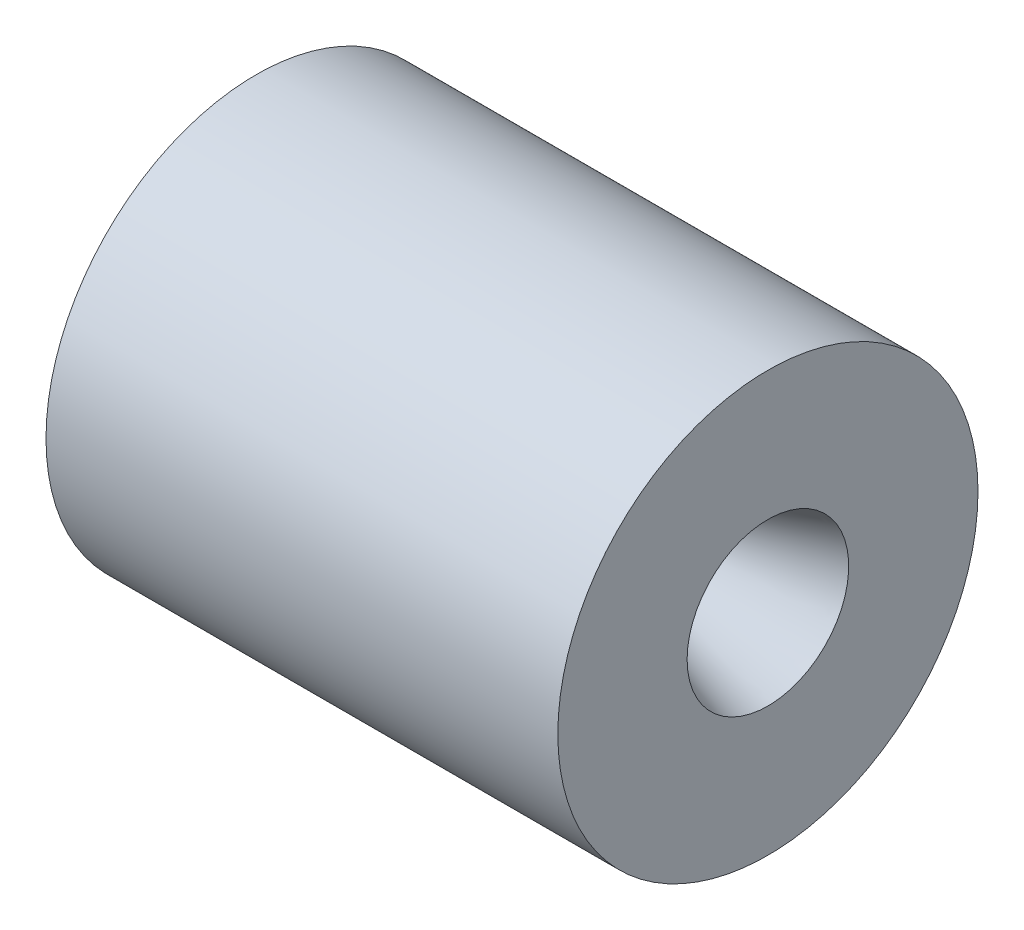
ISO-10303-21;
HEADER;
FILE_DESCRIPTION(('STEP AP214'),'2;1');
FILE_NAME('part.step','',(''),(''),'','','');
FILE_SCHEMA(('AUTOMOTIVE_DESIGN { 1 0 10303 214 1 1 1 1 }'));
ENDSEC;
DATA;
#1=APPLICATION_CONTEXT('core data for automotive mechanical design processes');
#2=APPLICATION_PROTOCOL_DEFINITION('international standard','automotive_design',2000,#1);
#3=PRODUCT_CONTEXT('',#1,'mechanical');
#4=PRODUCT('Part','Part','',(#3));
#5=PRODUCT_RELATED_PRODUCT_CATEGORY('part','',(#4));
#6=PRODUCT_DEFINITION_FORMATION('','',#4);
#7=PRODUCT_DEFINITION_CONTEXT('part definition',#1,'design');
#8=PRODUCT_DEFINITION('design','',#6,#7);
#9=PRODUCT_DEFINITION_SHAPE('','',#8);
#10=(LENGTH_UNIT() NAMED_UNIT(*) SI_UNIT(.MILLI.,.METRE.));
#11=(NAMED_UNIT(*) PLANE_ANGLE_UNIT() SI_UNIT($,.RADIAN.));
#12=(NAMED_UNIT(*) SI_UNIT($,.STERADIAN.) SOLID_ANGLE_UNIT());
#13=UNCERTAINTY_MEASURE_WITH_UNIT(LENGTH_MEASURE(1.E-05),#10,'distance_accuracy_value','');
#14=(GEOMETRIC_REPRESENTATION_CONTEXT(3) GLOBAL_UNCERTAINTY_ASSIGNED_CONTEXT((#13)) GLOBAL_UNIT_ASSIGNED_CONTEXT((#10,
#11,#12)) REPRESENTATION_CONTEXT('',''));
#15=CARTESIAN_POINT('',(0.,0.,0.));
#16=DIRECTION('',(0.,0.,1.));
#17=DIRECTION('',(1.,0.,0.));
#18=AXIS2_PLACEMENT_3D('',#15,#16,#17);
#19=CARTESIAN_POINT('',(0.,55.140272,0.));
#20=DIRECTION('',(1.,0.,0.));
#21=DIRECTION('',(0.,0.,-1.));
#22=AXIS2_PLACEMENT_3D('',#19,#20,#21);
#23=PLANE('',#22);
#24=CARTESIAN_POINT('',(0.,-69.,-2.40912212380176E-13));
#25=DIRECTION('',(-1.,0.,0.));
#26=DIRECTION('',(0.,0.,1.));
#27=AXIS2_PLACEMENT_3D('',#24,#25,#26);
#28=CIRCLE('',#27,2.0193);
#29=CARTESIAN_POINT('',(0.,-69.,2.01929999999976));
#30=VERTEX_POINT('',#29);
#31=EDGE_CURVE('E136',#30,#30,#28,.T.);
#32=ORIENTED_EDGE('',*,*,#31,.F.);
#33=EDGE_LOOP('',(#32));
#34=FACE_BOUND('',#33,.T.);
#35=CARTESIAN_POINT('',(0.,-59.7557528611264,34.4999999999999));
#36=DIRECTION('',(-1.,0.,0.));
#37=DIRECTION('',(0.,0.,1.));
#38=AXIS2_PLACEMENT_3D('',#35,#36,#37);
#39=CIRCLE('',#38,2.01929999999999);
#40=CARTESIAN_POINT('',(0.,-59.7557528611264,36.5192999999999));
#41=VERTEX_POINT('',#40);
#42=EDGE_CURVE('E142',#41,#41,#39,.T.);
#43=ORIENTED_EDGE('',*,*,#42,.F.);
#44=EDGE_LOOP('',(#43));
#45=FACE_BOUND('',#44,.T.);
#46=CARTESIAN_POINT('',(0.,-34.5000000000001,59.7557528611262));
#47=DIRECTION('',(-1.,0.,0.));
#48=DIRECTION('',(0.,0.,1.));
#49=AXIS2_PLACEMENT_3D('',#46,#47,#48);
#50=CIRCLE('',#49,2.0193);
#51=CARTESIAN_POINT('',(0.,-34.5000000000001,61.7750528611262));
#52=VERTEX_POINT('',#51);
#53=EDGE_CURVE('E148',#52,#52,#50,.T.);
#54=ORIENTED_EDGE('',*,*,#53,.F.);
#55=EDGE_LOOP('',(#54));
#56=FACE_BOUND('',#55,.T.);
#57=CARTESIAN_POINT('',(0.,0.,69.));
#58=DIRECTION('',(-1.,0.,0.));
#59=DIRECTION('',(0.,0.,1.));
#60=AXIS2_PLACEMENT_3D('',#57,#58,#59);
#61=CIRCLE('',#60,2.0193);
#62=CARTESIAN_POINT('',(0.,0.,71.0193));
#63=VERTEX_POINT('',#62);
#64=EDGE_CURVE('E154',#63,#63,#61,.T.);
#65=ORIENTED_EDGE('',*,*,#64,.F.);
#66=EDGE_LOOP('',(#65));
#67=FACE_BOUND('',#66,.T.);
#68=CARTESIAN_POINT('',(0.,0.,0.));
#69=DIRECTION('',(-1.,0.,0.));
#70=DIRECTION('',(0.,0.,1.));
#71=AXIS2_PLACEMENT_3D('',#68,#69,#70);
#72=CIRCLE('',#71,55.140272);
#73=CARTESIAN_POINT('',(0.,0.,55.140272));
#74=VERTEX_POINT('',#73);
#75=EDGE_CURVE('E181',#74,#74,#72,.T.);
#76=ORIENTED_EDGE('',*,*,#75,.F.);
#77=EDGE_LOOP('',(#76));
#78=FACE_BOUND('',#77,.T.);
#79=CARTESIAN_POINT('',(0.,0.,0.));
#80=DIRECTION('',(-1.,0.,0.));
#81=DIRECTION('',(0.,0.,1.));
#82=AXIS2_PLACEMENT_3D('',#79,#80,#81);
#83=CIRCLE('',#82,76.200272);
#84=CARTESIAN_POINT('',(0.,0.,76.200272));
#85=VERTEX_POINT('',#84);
#86=EDGE_CURVE('E184',#85,#85,#83,.T.);
#87=ORIENTED_EDGE('',*,*,#86,.T.);
#88=EDGE_LOOP('',(#87));
#89=FACE_BOUND('',#88,.T.);
#90=CARTESIAN_POINT('',(0.,-59.7557528611261,-34.5000000000003));
#91=DIRECTION('',(-1.,0.,0.));
#92=DIRECTION('',(0.,0.,1.));
#93=AXIS2_PLACEMENT_3D('',#90,#91,#92);
#94=CIRCLE('',#93,2.0193);
#95=CARTESIAN_POINT('',(0.,-59.7557528611261,-32.4807000000003));
#96=VERTEX_POINT('',#95);
#97=EDGE_CURVE('E130',#96,#96,#94,.T.);
#98=ORIENTED_EDGE('',*,*,#97,.F.);
#99=EDGE_LOOP('',(#98));
#100=FACE_BOUND('',#99,.T.);
#101=CARTESIAN_POINT('',(0.,-34.4999999999997,-59.7557528611265));
#102=DIRECTION('',(-1.,0.,0.));
#103=DIRECTION('',(0.,0.,1.));
#104=AXIS2_PLACEMENT_3D('',#101,#102,#103);
#105=CIRCLE('',#104,2.0193);
#106=CARTESIAN_POINT('',(0.,-34.4999999999997,-57.7364528611265));
#107=VERTEX_POINT('',#106);
#108=EDGE_CURVE('E124',#107,#107,#105,.T.);
#109=ORIENTED_EDGE('',*,*,#108,.F.);
#110=EDGE_LOOP('',(#109));
#111=FACE_BOUND('',#110,.T.);
#112=CARTESIAN_POINT('',(0.,0.,-69.));
#113=DIRECTION('',(-1.,0.,0.));
#114=DIRECTION('',(0.,0.,1.));
#115=AXIS2_PLACEMENT_3D('',#112,#113,#114);
#116=CIRCLE('',#115,2.0193);
#117=CARTESIAN_POINT('',(0.,0.,-66.9807));
#118=VERTEX_POINT('',#117);
#119=EDGE_CURVE('E118',#118,#118,#116,.T.);
#120=ORIENTED_EDGE('',*,*,#119,.F.);
#121=EDGE_LOOP('',(#120));
#122=FACE_BOUND('',#121,.T.);
#123=CARTESIAN_POINT('',(0.,34.5000000000005,-59.755752861126));
#124=DIRECTION('',(-1.,0.,0.));
#125=DIRECTION('',(0.,0.,1.));
#126=AXIS2_PLACEMENT_3D('',#123,#124,#125);
#127=CIRCLE('',#126,2.01929999999999);
#128=CARTESIAN_POINT('',(0.,34.5000000000005,-57.736452861126));
#129=VERTEX_POINT('',#128);
#130=EDGE_CURVE('E112',#129,#129,#127,.T.);
#131=ORIENTED_EDGE('',*,*,#130,.F.);
#132=EDGE_LOOP('',(#131));
#133=FACE_BOUND('',#132,.T.);
#134=CARTESIAN_POINT('',(0.,59.7557528611266,-34.4999999999994));
#135=DIRECTION('',(-1.,0.,0.));
#136=DIRECTION('',(0.,0.,1.));
#137=AXIS2_PLACEMENT_3D('',#134,#135,#136);
#138=CIRCLE('',#137,2.01929999999999);
#139=CARTESIAN_POINT('',(0.,59.7557528611266,-32.4806999999995));
#140=VERTEX_POINT('',#139);
#141=EDGE_CURVE('E106',#140,#140,#138,.T.);
#142=ORIENTED_EDGE('',*,*,#141,.F.);
#143=EDGE_LOOP('',(#142));
#144=FACE_BOUND('',#143,.T.);
#145=CARTESIAN_POINT('',(0.,69.,7.22736637140529E-13));
#146=DIRECTION('',(-1.,0.,0.));
#147=DIRECTION('',(0.,0.,1.));
#148=AXIS2_PLACEMENT_3D('',#145,#146,#147);
#149=CIRCLE('',#148,2.0193);
#150=CARTESIAN_POINT('',(0.,69.,2.01930000000072));
#151=VERTEX_POINT('',#150);
#152=EDGE_CURVE('E100',#151,#151,#149,.T.);
#153=ORIENTED_EDGE('',*,*,#152,.F.);
#154=EDGE_LOOP('',(#153));
#155=FACE_BOUND('',#154,.T.);
#156=CARTESIAN_POINT('',(0.,59.7557528611259,34.5000000000007));
#157=DIRECTION('',(-1.,0.,0.));
#158=DIRECTION('',(0.,0.,1.));
#159=AXIS2_PLACEMENT_3D('',#156,#157,#158);
#160=CIRCLE('',#159,2.01929999999999);
#161=CARTESIAN_POINT('',(0.,59.7557528611259,36.5193000000007));
#162=VERTEX_POINT('',#161);
#163=EDGE_CURVE('E89',#162,#162,#160,.T.);
#164=ORIENTED_EDGE('',*,*,#163,.F.);
#165=EDGE_LOOP('',(#164));
#166=FACE_BOUND('',#165,.T.);
#167=CARTESIAN_POINT('',(0.,34.4999999999992,59.7557528611267));
#168=DIRECTION('',(-1.,0.,0.));
#169=DIRECTION('',(0.,0.,1.));
#170=AXIS2_PLACEMENT_3D('',#167,#168,#169);
#171=CIRCLE('',#170,2.0193);
#172=CARTESIAN_POINT('',(0.,34.4999999999992,61.7750528611267));
#173=VERTEX_POINT('',#172);
#174=EDGE_CURVE('E90',#173,#173,#171,.T.);
#175=ORIENTED_EDGE('',*,*,#174,.F.);
#176=EDGE_LOOP('',(#175));
#177=FACE_BOUND('',#176,.T.);
#178=ADVANCED_FACE('F33',(#34,#45,#56,#67,#78,#89,#100,#111,#122,#133,#144,#155,#166,#177),#23,.F.);
#179=CARTESIAN_POINT('',(140.608875713067,14.0680911814763,0.));
#180=CARTESIAN_POINT('',(181.460140895811,28.0308978195395,0.));
#181=CARTESIAN_POINT('',(185.649173895811,29.3102708195395,0.));
#182=B_SPLINE_CURVE_WITH_KNOTS('',2,(#179,#180,#181),.UNSPECIFIED.,.F.,.F.,(3,3),(0.,1.),.UNSPECIFIED.);
#183=CARTESIAN_POINT('',(0.,0.,0.));
#184=DIRECTION('',(-1.,0.,0.));
#185=AXIS1_PLACEMENT('',#183,#184);
#186=SURFACE_OF_REVOLUTION('',#182,#185);
#187=CARTESIAN_POINT('',(185.649173895811,0.,0.));
#188=DIRECTION('',(-1.,0.,0.));
#189=DIRECTION('',(0.,0.,1.));
#190=AXIS2_PLACEMENT_3D('',#187,#188,#189);
#191=CIRCLE('',#190,29.3102708195395);
#192=CARTESIAN_POINT('',(185.649173895811,0.,29.3102708195395));
#193=VERTEX_POINT('',#192);
#194=EDGE_CURVE('E11',#193,#193,#191,.T.);
#195=ORIENTED_EDGE('',*,*,#194,.F.);
#196=EDGE_LOOP('',(#195));
#197=FACE_BOUND('',#196,.T.);
#198=CARTESIAN_POINT('',(140.608875713067,0.,0.));
#199=DIRECTION('',(-1.,0.,0.));
#200=DIRECTION('',(0.,0.,1.));
#201=AXIS2_PLACEMENT_3D('',#198,#199,#200);
#202=CIRCLE('',#201,14.0680911814763);
#203=CARTESIAN_POINT('',(140.608875713067,0.,14.0680911814763));
#204=VERTEX_POINT('',#203);
#205=EDGE_CURVE('E159',#204,#204,#202,.T.);
#206=ORIENTED_EDGE('',*,*,#205,.T.);
#207=EDGE_LOOP('',(#206));
#208=FACE_BOUND('',#207,.T.);
#209=ADVANCED_FACE('F35',(#197,#208),#186,.T.);
#210=CARTESIAN_POINT('',(185.649173895811,76.200272,0.));
#211=DIRECTION('',(-1.,0.,0.));
#212=DIRECTION('',(0.,0.,1.));
#213=AXIS2_PLACEMENT_3D('',#210,#211,#212);
#214=PLANE('',#213);
#215=CARTESIAN_POINT('',(185.649173895811,0.,0.));
#216=DIRECTION('',(-1.,0.,0.));
#217=DIRECTION('',(0.,0.,1.));
#218=AXIS2_PLACEMENT_3D('',#215,#216,#217);
#219=CIRCLE('',#218,76.200272);
#220=CARTESIAN_POINT('',(185.649173895811,0.,76.200272));
#221=VERTEX_POINT('',#220);
#222=EDGE_CURVE('E42',#221,#221,#219,.T.);
#223=ORIENTED_EDGE('',*,*,#222,.F.);
#224=EDGE_LOOP('',(#223));
#225=FACE_BOUND('',#224,.T.);
#226=ORIENTED_EDGE('',*,*,#194,.T.);
#227=EDGE_LOOP('',(#226));
#228=FACE_BOUND('',#227,.T.);
#229=ADVANCED_FACE('F191',(#225,#228),#214,.F.);
#230=CARTESIAN_POINT('',(0.,0.,0.));
#231=DIRECTION('',(-1.,0.,0.));
#232=DIRECTION('',(0.,0.,1.));
#233=AXIS2_PLACEMENT_3D('',#230,#231,#232);
#234=CYLINDRICAL_SURFACE('',#233,76.200272);
#235=ORIENTED_EDGE('',*,*,#86,.F.);
#236=EDGE_LOOP('',(#235));
#237=FACE_BOUND('',#236,.T.);
#238=ORIENTED_EDGE('',*,*,#222,.T.);
#239=EDGE_LOOP('',(#238));
#240=FACE_BOUND('',#239,.T.);
#241=ADVANCED_FACE('F189',(#237,#240),#234,.T.);
#242=CARTESIAN_POINT('',(0.,0.,0.));
#243=DIRECTION('',(-1.,0.,0.));
#244=DIRECTION('',(0.,0.,1.));
#245=AXIS2_PLACEMENT_3D('',#242,#243,#244);
#246=CYLINDRICAL_SURFACE('',#245,55.140272);
#247=CARTESIAN_POINT('',(23.150958,0.,0.));
#248=DIRECTION('',(-1.,0.,0.));
#249=DIRECTION('',(0.,0.,1.));
#250=AXIS2_PLACEMENT_3D('',#247,#248,#249);
#251=CIRCLE('',#250,55.140272);
#252=CARTESIAN_POINT('',(23.150958,0.,55.140272));
#253=VERTEX_POINT('',#252);
#254=EDGE_CURVE('E178',#253,#253,#251,.T.);
#255=ORIENTED_EDGE('',*,*,#254,.F.);
#256=EDGE_LOOP('',(#255));
#257=FACE_BOUND('',#256,.T.);
#258=ORIENTED_EDGE('',*,*,#75,.T.);
#259=EDGE_LOOP('',(#258));
#260=FACE_BOUND('',#259,.T.);
#261=ADVANCED_FACE('F222',(#257,#260),#246,.F.);
#262=CARTESIAN_POINT('',(23.1509564613662,0.,0.));
#263=DIRECTION('',(-1.,0.,0.));
#264=DIRECTION('',(0.,0.,1.));
#265=AXIS2_PLACEMENT_3D('',#262,#263,#264);
#266=DEGENERATE_TOROIDAL_SURFACE('',#265,88.860648,144.00092,.F.);
#267=CARTESIAN_POINT('',(95.151418,0.,0.));
#268=DIRECTION('',(-1.,0.,0.));
#269=DIRECTION('',(0.,0.,1.));
#270=AXIS2_PLACEMENT_3D('',#267,#268,#269);
#271=CIRCLE('',#270,35.847806);
#272=CARTESIAN_POINT('',(95.151418,0.,35.847806));
#273=VERTEX_POINT('',#272);
#274=EDGE_CURVE('E175',#273,#273,#271,.T.);
#275=ORIENTED_EDGE('',*,*,#274,.F.);
#276=EDGE_LOOP('',(#275));
#277=FACE_BOUND('',#276,.T.);
#278=ORIENTED_EDGE('',*,*,#254,.T.);
#279=EDGE_LOOP('',(#278));
#280=FACE_BOUND('',#279,.T.);
#281=ADVANCED_FACE('F216',(#277,#280),#266,.T.);
#282=CARTESIAN_POINT('',(95.151418,0.,0.));
#283=DIRECTION('',(-1.,0.,0.));
#284=DIRECTION('',(0.,0.,1.));
#285=AXIS2_PLACEMENT_3D('',#282,#283,#284);
#286=CONICAL_SURFACE('',#285,35.847806,0.523598775598299);
#287=CARTESIAN_POINT('',(128.566947895811,0.,0.));
#288=DIRECTION('',(-1.,0.,0.));
#289=DIRECTION('',(0.,0.,1.));
#290=AXIS2_PLACEMENT_3D('',#287,#288,#289);
#291=CIRCLE('',#290,16.5553408195395);
#292=CARTESIAN_POINT('',(128.566947895811,0.,16.5553408195395));
#293=VERTEX_POINT('',#292);
#294=EDGE_CURVE('E172',#293,#293,#291,.T.);
#295=ORIENTED_EDGE('',*,*,#294,.F.);
#296=EDGE_LOOP('',(#295));
#297=FACE_BOUND('',#296,.T.);
#298=ORIENTED_EDGE('',*,*,#274,.T.);
#299=EDGE_LOOP('',(#298));
#300=FACE_BOUND('',#299,.T.);
#301=ADVANCED_FACE('F210',(#297,#300),#286,.F.);
#302=CARTESIAN_POINT('',(138.905748239959,0.,0.));
#303=DIRECTION('',(-1.,0.,0.));
#304=DIRECTION('',(0.,0.,1.));
#305=AXIS2_PLACEMENT_3D('',#302,#303,#304);
#306=TOROIDAL_SURFACE('',#305,34.4626698195395,20.677602);
#307=CARTESIAN_POINT('',(138.905748895811,0.,0.));
#308=DIRECTION('',(-1.,0.,0.));
#309=DIRECTION('',(0.,0.,1.));
#310=AXIS2_PLACEMENT_3D('',#307,#308,#309);
#311=CIRCLE('',#310,13.7850678195395);
#312=CARTESIAN_POINT('',(138.905748895811,0.,13.7850678195395));
#313=VERTEX_POINT('',#312);
#314=EDGE_CURVE('E169',#313,#313,#311,.T.);
#315=ORIENTED_EDGE('',*,*,#314,.F.);
#316=EDGE_LOOP('',(#315));
#317=FACE_BOUND('',#316,.T.);
#318=ORIENTED_EDGE('',*,*,#294,.T.);
#319=EDGE_LOOP('',(#318));
#320=FACE_BOUND('',#319,.T.);
#321=ADVANCED_FACE('F204',(#317,#320),#306,.T.);
#322=CARTESIAN_POINT('',(138.905748895811,0.,0.));
#323=DIRECTION('',(-1.,0.,0.));
#324=DIRECTION('',(0.,0.,1.));
#325=AXIS2_PLACEMENT_3D('',#322,#323,#324);
#326=TOROIDAL_SURFACE('',#325,19.0509638195395,5.265896);
#327=ORIENTED_EDGE('',*,*,#205,.F.);
#328=EDGE_LOOP('',(#327));
#329=FACE_BOUND('',#328,.T.);
#330=ORIENTED_EDGE('',*,*,#314,.T.);
#331=EDGE_LOOP('',(#330));
#332=FACE_BOUND('',#331,.T.);
#333=ADVANCED_FACE('F200',(#329,#332),#326,.T.);
#334=CARTESIAN_POINT('',(25.,0.,69.));
#335=DIRECTION('',(-1.,0.,0.));
#336=DIRECTION('',(0.,0.,1.));
#337=AXIS2_PLACEMENT_3D('',#334,#335,#336);
#338=CONICAL_SURFACE('',#337,2.0193,1.02974425867665);
#339=CARTESIAN_POINT('',(26.2133178480024,0.,69.));
#340=VERTEX_POINT('',#339);
#341=VERTEX_LOOP('',#340);
#342=FACE_BOUND('',#341,.T.);
#343=CARTESIAN_POINT('',(25.,0.,69.));
#344=DIRECTION('',(-1.,0.,0.));
#345=DIRECTION('',(0.,0.,1.));
#346=AXIS2_PLACEMENT_3D('',#343,#344,#345);
#347=CIRCLE('',#346,2.0193);
#348=CARTESIAN_POINT('',(25.,0.,71.0193));
#349=VERTEX_POINT('',#348);
#350=EDGE_CURVE('E157',#349,#349,#347,.T.);
#351=ORIENTED_EDGE('',*,*,#350,.T.);
#352=EDGE_LOOP('',(#351));
#353=FACE_BOUND('',#352,.T.);
#354=ADVANCED_FACE('F203',(#342,#353),#338,.F.);
#355=CARTESIAN_POINT('',(0.,0.,69.));
#356=DIRECTION('',(-1.,0.,0.));
#357=DIRECTION('',(0.,0.,1.));
#358=AXIS2_PLACEMENT_3D('',#355,#356,#357);
#359=CYLINDRICAL_SURFACE('',#358,2.0193);
#360=ORIENTED_EDGE('',*,*,#350,.F.);
#361=EDGE_LOOP('',(#360));
#362=FACE_BOUND('',#361,.T.);
#363=ORIENTED_EDGE('',*,*,#64,.T.);
#364=EDGE_LOOP('',(#363));
#365=FACE_BOUND('',#364,.T.);
#366=ADVANCED_FACE('F336',(#362,#365),#359,.F.);
#367=CARTESIAN_POINT('',(25.,-34.5000000000001,59.7557528611262));
#368=DIRECTION('',(-1.,0.,0.));
#369=DIRECTION('',(0.,0.,1.));
#370=AXIS2_PLACEMENT_3D('',#367,#368,#369);
#371=CONICAL_SURFACE('',#370,2.01929999999999,1.02974425867665);
#372=CARTESIAN_POINT('',(26.2133178480024,-34.5000000000001,59.7557528611262));
#373=VERTEX_POINT('',#372);
#374=VERTEX_LOOP('',#373);
#375=FACE_BOUND('',#374,.T.);
#376=CARTESIAN_POINT('',(25.,-34.5000000000001,59.7557528611262));
#377=DIRECTION('',(-1.,0.,0.));
#378=DIRECTION('',(0.,0.,1.));
#379=AXIS2_PLACEMENT_3D('',#376,#377,#378);
#380=CIRCLE('',#379,2.01929999999999);
#381=CARTESIAN_POINT('',(25.,-34.5000000000001,61.7750528611262));
#382=VERTEX_POINT('',#381);
#383=EDGE_CURVE('E151',#382,#382,#380,.T.);
#384=ORIENTED_EDGE('',*,*,#383,.T.);
#385=EDGE_LOOP('',(#384));
#386=FACE_BOUND('',#385,.T.);
#387=ADVANCED_FACE('F332',(#375,#386),#371,.F.);
#388=CARTESIAN_POINT('',(0.,-34.5000000000001,59.7557528611262));
#389=DIRECTION('',(-1.,0.,0.));
#390=DIRECTION('',(0.,0.,1.));
#391=AXIS2_PLACEMENT_3D('',#388,#389,#390);
#392=CYLINDRICAL_SURFACE('',#391,2.0193);
#393=ORIENTED_EDGE('',*,*,#383,.F.);
#394=EDGE_LOOP('',(#393));
#395=FACE_BOUND('',#394,.T.);
#396=ORIENTED_EDGE('',*,*,#53,.T.);
#397=EDGE_LOOP('',(#396));
#398=FACE_BOUND('',#397,.T.);
#399=ADVANCED_FACE('F328',(#395,#398),#392,.F.);
#400=CARTESIAN_POINT('',(25.,-59.7557528611264,34.4999999999999));
#401=DIRECTION('',(-1.,0.,0.));
#402=DIRECTION('',(0.,0.,1.));
#403=AXIS2_PLACEMENT_3D('',#400,#401,#402);
#404=CONICAL_SURFACE('',#403,2.01929999999999,1.02974425867665);
#405=CARTESIAN_POINT('',(26.2133178480024,-59.7557528611264,34.4999999999999));
#406=VERTEX_POINT('',#405);
#407=VERTEX_LOOP('',#406);
#408=FACE_BOUND('',#407,.T.);
#409=CARTESIAN_POINT('',(25.,-59.7557528611264,34.4999999999999));
#410=DIRECTION('',(-1.,0.,0.));
#411=DIRECTION('',(0.,0.,1.));
#412=AXIS2_PLACEMENT_3D('',#409,#410,#411);
#413=CIRCLE('',#412,2.01929999999999);
#414=CARTESIAN_POINT('',(25.,-59.7557528611264,36.5192999999999));
#415=VERTEX_POINT('',#414);
#416=EDGE_CURVE('E145',#415,#415,#413,.T.);
#417=ORIENTED_EDGE('',*,*,#416,.T.);
#418=EDGE_LOOP('',(#417));
#419=FACE_BOUND('',#418,.T.);
#420=ADVANCED_FACE('F324',(#408,#419),#404,.F.);
#421=CARTESIAN_POINT('',(0.,-59.7557528611264,34.4999999999999));
#422=DIRECTION('',(-1.,0.,0.));
#423=DIRECTION('',(0.,0.,1.));
#424=AXIS2_PLACEMENT_3D('',#421,#422,#423);
#425=CYLINDRICAL_SURFACE('',#424,2.01929999999999);
#426=ORIENTED_EDGE('',*,*,#416,.F.);
#427=EDGE_LOOP('',(#426));
#428=FACE_BOUND('',#427,.T.);
#429=ORIENTED_EDGE('',*,*,#42,.T.);
#430=EDGE_LOOP('',(#429));
#431=FACE_BOUND('',#430,.T.);
#432=ADVANCED_FACE('F320',(#428,#431),#425,.F.);
#433=CARTESIAN_POINT('',(25.,-69.,-2.40912212380176E-13));
#434=DIRECTION('',(-1.,0.,0.));
#435=DIRECTION('',(0.,0.,1.));
#436=AXIS2_PLACEMENT_3D('',#433,#434,#435);
#437=CONICAL_SURFACE('',#436,2.0193,1.02974425867665);
#438=CARTESIAN_POINT('',(26.2133178480024,-69.,-2.40912212380176E-13));
#439=VERTEX_POINT('',#438);
#440=VERTEX_LOOP('',#439);
#441=FACE_BOUND('',#440,.T.);
#442=CARTESIAN_POINT('',(25.,-69.,-2.40912212380176E-13));
#443=DIRECTION('',(-1.,0.,0.));
#444=DIRECTION('',(0.,0.,1.));
#445=AXIS2_PLACEMENT_3D('',#442,#443,#444);
#446=CIRCLE('',#445,2.0193);
#447=CARTESIAN_POINT('',(25.,-69.,2.01929999999976));
#448=VERTEX_POINT('',#447);
#449=EDGE_CURVE('E139',#448,#448,#446,.T.);
#450=ORIENTED_EDGE('',*,*,#449,.T.);
#451=EDGE_LOOP('',(#450));
#452=FACE_BOUND('',#451,.T.);
#453=ADVANCED_FACE('F316',(#441,#452),#437,.F.);
#454=CARTESIAN_POINT('',(0.,-69.,-2.40912212380176E-13));
#455=DIRECTION('',(-1.,0.,0.));
#456=DIRECTION('',(0.,0.,1.));
#457=AXIS2_PLACEMENT_3D('',#454,#455,#456);
#458=CYLINDRICAL_SURFACE('',#457,2.0193);
#459=ORIENTED_EDGE('',*,*,#449,.F.);
#460=EDGE_LOOP('',(#459));
#461=FACE_BOUND('',#460,.T.);
#462=ORIENTED_EDGE('',*,*,#31,.T.);
#463=EDGE_LOOP('',(#462));
#464=FACE_BOUND('',#463,.T.);
#465=ADVANCED_FACE('F312',(#461,#464),#458,.F.);
#466=CARTESIAN_POINT('',(25.,-59.7557528611261,-34.5000000000003));
#467=DIRECTION('',(-1.,0.,0.));
#468=DIRECTION('',(0.,0.,1.));
#469=AXIS2_PLACEMENT_3D('',#466,#467,#468);
#470=CONICAL_SURFACE('',#469,2.01929999999999,1.02974425867665);
#471=CARTESIAN_POINT('',(26.2133178480024,-59.7557528611261,-34.5000000000003));
#472=VERTEX_POINT('',#471);
#473=VERTEX_LOOP('',#472);
#474=FACE_BOUND('',#473,.T.);
#475=CARTESIAN_POINT('',(25.,-59.7557528611261,-34.5000000000003));
#476=DIRECTION('',(-1.,0.,0.));
#477=DIRECTION('',(0.,0.,1.));
#478=AXIS2_PLACEMENT_3D('',#475,#476,#477);
#479=CIRCLE('',#478,2.01929999999999);
#480=CARTESIAN_POINT('',(25.,-59.7557528611261,-32.4807000000003));
#481=VERTEX_POINT('',#480);
#482=EDGE_CURVE('E133',#481,#481,#479,.T.);
#483=ORIENTED_EDGE('',*,*,#482,.T.);
#484=EDGE_LOOP('',(#483));
#485=FACE_BOUND('',#484,.T.);
#486=ADVANCED_FACE('F308',(#474,#485),#470,.F.);
#487=CARTESIAN_POINT('',(0.,-59.7557528611261,-34.5000000000003));
#488=DIRECTION('',(-1.,0.,0.));
#489=DIRECTION('',(0.,0.,1.));
#490=AXIS2_PLACEMENT_3D('',#487,#488,#489);
#491=CYLINDRICAL_SURFACE('',#490,2.0193);
#492=ORIENTED_EDGE('',*,*,#482,.F.);
#493=EDGE_LOOP('',(#492));
#494=FACE_BOUND('',#493,.T.);
#495=ORIENTED_EDGE('',*,*,#97,.T.);
#496=EDGE_LOOP('',(#495));
#497=FACE_BOUND('',#496,.T.);
#498=ADVANCED_FACE('F304',(#494,#497),#491,.F.);
#499=CARTESIAN_POINT('',(25.,-34.4999999999997,-59.7557528611265));
#500=DIRECTION('',(-1.,0.,0.));
#501=DIRECTION('',(0.,0.,1.));
#502=AXIS2_PLACEMENT_3D('',#499,#500,#501);
#503=CONICAL_SURFACE('',#502,2.01929999999999,1.02974425867665);
#504=CARTESIAN_POINT('',(26.2133178480024,-34.4999999999997,-59.7557528611265));
#505=VERTEX_POINT('',#504);
#506=VERTEX_LOOP('',#505);
#507=FACE_BOUND('',#506,.T.);
#508=CARTESIAN_POINT('',(25.,-34.4999999999997,-59.7557528611265));
#509=DIRECTION('',(-1.,0.,0.));
#510=DIRECTION('',(0.,0.,1.));
#511=AXIS2_PLACEMENT_3D('',#508,#509,#510);
#512=CIRCLE('',#511,2.01929999999999);
#513=CARTESIAN_POINT('',(25.,-34.4999999999997,-57.7364528611265));
#514=VERTEX_POINT('',#513);
#515=EDGE_CURVE('E127',#514,#514,#512,.T.);
#516=ORIENTED_EDGE('',*,*,#515,.T.);
#517=EDGE_LOOP('',(#516));
#518=FACE_BOUND('',#517,.T.);
#519=ADVANCED_FACE('F300',(#507,#518),#503,.F.);
#520=CARTESIAN_POINT('',(0.,-34.4999999999997,-59.7557528611265));
#521=DIRECTION('',(-1.,0.,0.));
#522=DIRECTION('',(0.,0.,1.));
#523=AXIS2_PLACEMENT_3D('',#520,#521,#522);
#524=CYLINDRICAL_SURFACE('',#523,2.0193);
#525=ORIENTED_EDGE('',*,*,#515,.F.);
#526=EDGE_LOOP('',(#525));
#527=FACE_BOUND('',#526,.T.);
#528=ORIENTED_EDGE('',*,*,#108,.T.);
#529=EDGE_LOOP('',(#528));
#530=FACE_BOUND('',#529,.T.);
#531=ADVANCED_FACE('F296',(#527,#530),#524,.F.);
#532=CARTESIAN_POINT('',(25.,0.,-69.));
#533=DIRECTION('',(-1.,0.,0.));
#534=DIRECTION('',(0.,0.,1.));
#535=AXIS2_PLACEMENT_3D('',#532,#533,#534);
#536=CONICAL_SURFACE('',#535,2.0193,1.02974425867665);
#537=CARTESIAN_POINT('',(26.2133178480024,0.,-69.));
#538=VERTEX_POINT('',#537);
#539=VERTEX_LOOP('',#538);
#540=FACE_BOUND('',#539,.T.);
#541=CARTESIAN_POINT('',(25.,0.,-69.));
#542=DIRECTION('',(-1.,0.,0.));
#543=DIRECTION('',(0.,0.,1.));
#544=AXIS2_PLACEMENT_3D('',#541,#542,#543);
#545=CIRCLE('',#544,2.0193);
#546=CARTESIAN_POINT('',(25.,0.,-66.9807));
#547=VERTEX_POINT('',#546);
#548=EDGE_CURVE('E121',#547,#547,#545,.T.);
#549=ORIENTED_EDGE('',*,*,#548,.T.);
#550=EDGE_LOOP('',(#549));
#551=FACE_BOUND('',#550,.T.);
#552=ADVANCED_FACE('F292',(#540,#551),#536,.F.);
#553=CARTESIAN_POINT('',(0.,0.,-69.));
#554=DIRECTION('',(-1.,0.,0.));
#555=DIRECTION('',(0.,0.,1.));
#556=AXIS2_PLACEMENT_3D('',#553,#554,#555);
#557=CYLINDRICAL_SURFACE('',#556,2.0193);
#558=ORIENTED_EDGE('',*,*,#548,.F.);
#559=EDGE_LOOP('',(#558));
#560=FACE_BOUND('',#559,.T.);
#561=ORIENTED_EDGE('',*,*,#119,.T.);
#562=EDGE_LOOP('',(#561));
#563=FACE_BOUND('',#562,.T.);
#564=ADVANCED_FACE('F288',(#560,#563),#557,.F.);
#565=CARTESIAN_POINT('',(25.,34.5000000000005,-59.755752861126));
#566=DIRECTION('',(-1.,0.,0.));
#567=DIRECTION('',(0.,0.,1.));
#568=AXIS2_PLACEMENT_3D('',#565,#566,#567);
#569=CONICAL_SURFACE('',#568,2.01929999999999,1.02974425867665);
#570=CARTESIAN_POINT('',(26.2133178480024,34.5000000000005,-59.755752861126));
#571=VERTEX_POINT('',#570);
#572=VERTEX_LOOP('',#571);
#573=FACE_BOUND('',#572,.T.);
#574=CARTESIAN_POINT('',(25.,34.5000000000005,-59.755752861126));
#575=DIRECTION('',(-1.,0.,0.));
#576=DIRECTION('',(0.,0.,1.));
#577=AXIS2_PLACEMENT_3D('',#574,#575,#576);
#578=CIRCLE('',#577,2.01929999999999);
#579=CARTESIAN_POINT('',(25.,34.5000000000005,-57.736452861126));
#580=VERTEX_POINT('',#579);
#581=EDGE_CURVE('E115',#580,#580,#578,.T.);
#582=ORIENTED_EDGE('',*,*,#581,.T.);
#583=EDGE_LOOP('',(#582));
#584=FACE_BOUND('',#583,.T.);
#585=ADVANCED_FACE('F284',(#573,#584),#569,.F.);
#586=CARTESIAN_POINT('',(0.,34.5000000000005,-59.755752861126));
#587=DIRECTION('',(-1.,0.,0.));
#588=DIRECTION('',(0.,0.,1.));
#589=AXIS2_PLACEMENT_3D('',#586,#587,#588);
#590=CYLINDRICAL_SURFACE('',#589,2.01929999999999);
#591=ORIENTED_EDGE('',*,*,#581,.F.);
#592=EDGE_LOOP('',(#591));
#593=FACE_BOUND('',#592,.T.);
#594=ORIENTED_EDGE('',*,*,#130,.T.);
#595=EDGE_LOOP('',(#594));
#596=FACE_BOUND('',#595,.T.);
#597=ADVANCED_FACE('F280',(#593,#596),#590,.F.);
#598=CARTESIAN_POINT('',(25.,59.7557528611266,-34.4999999999994));
#599=DIRECTION('',(-1.,0.,0.));
#600=DIRECTION('',(0.,0.,1.));
#601=AXIS2_PLACEMENT_3D('',#598,#599,#600);
#602=CONICAL_SURFACE('',#601,2.01929999999999,1.02974425867665);
#603=CARTESIAN_POINT('',(26.2133178480024,59.7557528611266,-34.4999999999994));
#604=VERTEX_POINT('',#603);
#605=VERTEX_LOOP('',#604);
#606=FACE_BOUND('',#605,.T.);
#607=CARTESIAN_POINT('',(25.,59.7557528611266,-34.4999999999994));
#608=DIRECTION('',(-1.,0.,0.));
#609=DIRECTION('',(0.,0.,1.));
#610=AXIS2_PLACEMENT_3D('',#607,#608,#609);
#611=CIRCLE('',#610,2.01929999999999);
#612=CARTESIAN_POINT('',(25.,59.7557528611266,-32.4806999999995));
#613=VERTEX_POINT('',#612);
#614=EDGE_CURVE('E109',#613,#613,#611,.T.);
#615=ORIENTED_EDGE('',*,*,#614,.T.);
#616=EDGE_LOOP('',(#615));
#617=FACE_BOUND('',#616,.T.);
#618=ADVANCED_FACE('F276',(#606,#617),#602,.F.);
#619=CARTESIAN_POINT('',(0.,59.7557528611266,-34.4999999999994));
#620=DIRECTION('',(-1.,0.,0.));
#621=DIRECTION('',(0.,0.,1.));
#622=AXIS2_PLACEMENT_3D('',#619,#620,#621);
#623=CYLINDRICAL_SURFACE('',#622,2.01929999999999);
#624=ORIENTED_EDGE('',*,*,#614,.F.);
#625=EDGE_LOOP('',(#624));
#626=FACE_BOUND('',#625,.T.);
#627=ORIENTED_EDGE('',*,*,#141,.T.);
#628=EDGE_LOOP('',(#627));
#629=FACE_BOUND('',#628,.T.);
#630=ADVANCED_FACE('F272',(#626,#629),#623,.F.);
#631=CARTESIAN_POINT('',(25.,69.,7.22736637140529E-13));
#632=DIRECTION('',(-1.,0.,0.));
#633=DIRECTION('',(0.,0.,1.));
#634=AXIS2_PLACEMENT_3D('',#631,#632,#633);
#635=CONICAL_SURFACE('',#634,2.0193,1.02974425867665);
#636=CARTESIAN_POINT('',(26.2133178480024,69.,7.22736637140529E-13));
#637=VERTEX_POINT('',#636);
#638=VERTEX_LOOP('',#637);
#639=FACE_BOUND('',#638,.T.);
#640=CARTESIAN_POINT('',(25.,69.,7.22736637140529E-13));
#641=DIRECTION('',(-1.,0.,0.));
#642=DIRECTION('',(0.,0.,1.));
#643=AXIS2_PLACEMENT_3D('',#640,#641,#642);
#644=CIRCLE('',#643,2.0193);
#645=CARTESIAN_POINT('',(25.,69.,2.01930000000072));
#646=VERTEX_POINT('',#645);
#647=EDGE_CURVE('E103',#646,#646,#644,.T.);
#648=ORIENTED_EDGE('',*,*,#647,.T.);
#649=EDGE_LOOP('',(#648));
#650=FACE_BOUND('',#649,.T.);
#651=ADVANCED_FACE('F268',(#639,#650),#635,.F.);
#652=CARTESIAN_POINT('',(0.,69.,7.22736637140529E-13));
#653=DIRECTION('',(-1.,0.,0.));
#654=DIRECTION('',(0.,0.,1.));
#655=AXIS2_PLACEMENT_3D('',#652,#653,#654);
#656=CYLINDRICAL_SURFACE('',#655,2.0193);
#657=ORIENTED_EDGE('',*,*,#647,.F.);
#658=EDGE_LOOP('',(#657));
#659=FACE_BOUND('',#658,.T.);
#660=ORIENTED_EDGE('',*,*,#152,.T.);
#661=EDGE_LOOP('',(#660));
#662=FACE_BOUND('',#661,.T.);
#663=ADVANCED_FACE('F264',(#659,#662),#656,.F.);
#664=CARTESIAN_POINT('',(25.,59.7557528611259,34.5000000000007));
#665=DIRECTION('',(-1.,0.,0.));
#666=DIRECTION('',(0.,0.,1.));
#667=AXIS2_PLACEMENT_3D('',#664,#665,#666);
#668=CONICAL_SURFACE('',#667,2.01929999999999,1.02974425867665);
#669=CARTESIAN_POINT('',(26.2133178480024,59.7557528611259,34.5000000000007));
#670=VERTEX_POINT('',#669);
#671=VERTEX_LOOP('',#670);
#672=FACE_BOUND('',#671,.T.);
#673=CARTESIAN_POINT('',(25.,59.7557528611259,34.5000000000007));
#674=DIRECTION('',(-1.,0.,0.));
#675=DIRECTION('',(0.,0.,1.));
#676=AXIS2_PLACEMENT_3D('',#673,#674,#675);
#677=CIRCLE('',#676,2.01929999999999);
#678=CARTESIAN_POINT('',(25.,59.7557528611259,36.5193000000007));
#679=VERTEX_POINT('',#678);
#680=EDGE_CURVE('E93',#679,#679,#677,.T.);
#681=ORIENTED_EDGE('',*,*,#680,.T.);
#682=EDGE_LOOP('',(#681));
#683=FACE_BOUND('',#682,.T.);
#684=ADVANCED_FACE('F260',(#672,#683),#668,.F.);
#685=CARTESIAN_POINT('',(0.,59.7557528611259,34.5000000000007));
#686=DIRECTION('',(-1.,0.,0.));
#687=DIRECTION('',(0.,0.,1.));
#688=AXIS2_PLACEMENT_3D('',#685,#686,#687);
#689=CYLINDRICAL_SURFACE('',#688,2.01929999999999);
#690=ORIENTED_EDGE('',*,*,#680,.F.);
#691=EDGE_LOOP('',(#690));
#692=FACE_BOUND('',#691,.T.);
#693=ORIENTED_EDGE('',*,*,#163,.T.);
#694=EDGE_LOOP('',(#693));
#695=FACE_BOUND('',#694,.T.);
#696=ADVANCED_FACE('F83',(#692,#695),#689,.F.);
#697=CARTESIAN_POINT('',(25.,34.4999999999992,59.7557528611267));
#698=DIRECTION('',(-1.,0.,0.));
#699=DIRECTION('',(0.,0.,1.));
#700=AXIS2_PLACEMENT_3D('',#697,#698,#699);
#701=CONICAL_SURFACE('',#700,2.01929999999999,1.02974425867665);
#702=CARTESIAN_POINT('',(26.2133178480024,34.4999999999992,59.7557528611267));
#703=VERTEX_POINT('',#702);
#704=VERTEX_LOOP('',#703);
#705=FACE_BOUND('',#704,.T.);
#706=CARTESIAN_POINT('',(25.,34.4999999999992,59.7557528611267));
#707=DIRECTION('',(-1.,0.,0.));
#708=DIRECTION('',(0.,0.,1.));
#709=AXIS2_PLACEMENT_3D('',#706,#707,#708);
#710=CIRCLE('',#709,2.01929999999999);
#711=CARTESIAN_POINT('',(25.,34.4999999999992,61.7750528611267));
#712=VERTEX_POINT('',#711);
#713=EDGE_CURVE('E87',#712,#712,#710,.T.);
#714=ORIENTED_EDGE('',*,*,#713,.T.);
#715=EDGE_LOOP('',(#714));
#716=FACE_BOUND('',#715,.T.);
#717=ADVANCED_FACE('F79',(#705,#716),#701,.F.);
#718=CARTESIAN_POINT('',(0.,34.4999999999992,59.7557528611267));
#719=DIRECTION('',(-1.,0.,0.));
#720=DIRECTION('',(0.,0.,1.));
#721=AXIS2_PLACEMENT_3D('',#718,#719,#720);
#722=CYLINDRICAL_SURFACE('',#721,2.0193);
#723=ORIENTED_EDGE('',*,*,#713,.F.);
#724=EDGE_LOOP('',(#723));
#725=FACE_BOUND('',#724,.T.);
#726=ORIENTED_EDGE('',*,*,#174,.T.);
#727=EDGE_LOOP('',(#726));
#728=FACE_BOUND('',#727,.T.);
#729=ADVANCED_FACE('F82',(#725,#728),#722,.F.);
#730=CLOSED_SHELL('',(#178,#209,#229,#241,#261,#281,#301,#321,#333,#354,#366,#387,#399,#420,
#432,#453,#465,#486,#498,#519,#531,#552,#564,#585,#597,#618,#630,#651,#663,#684,#696,#717,#729));
#731=MANIFOLD_SOLID_BREP('B2',#730);
#732=ADVANCED_BREP_SHAPE_REPRESENTATION('',(#18,#731),#14);
#733=SHAPE_DEFINITION_REPRESENTATION(#9,#732);
ENDSEC;
END-ISO-10303-21;
